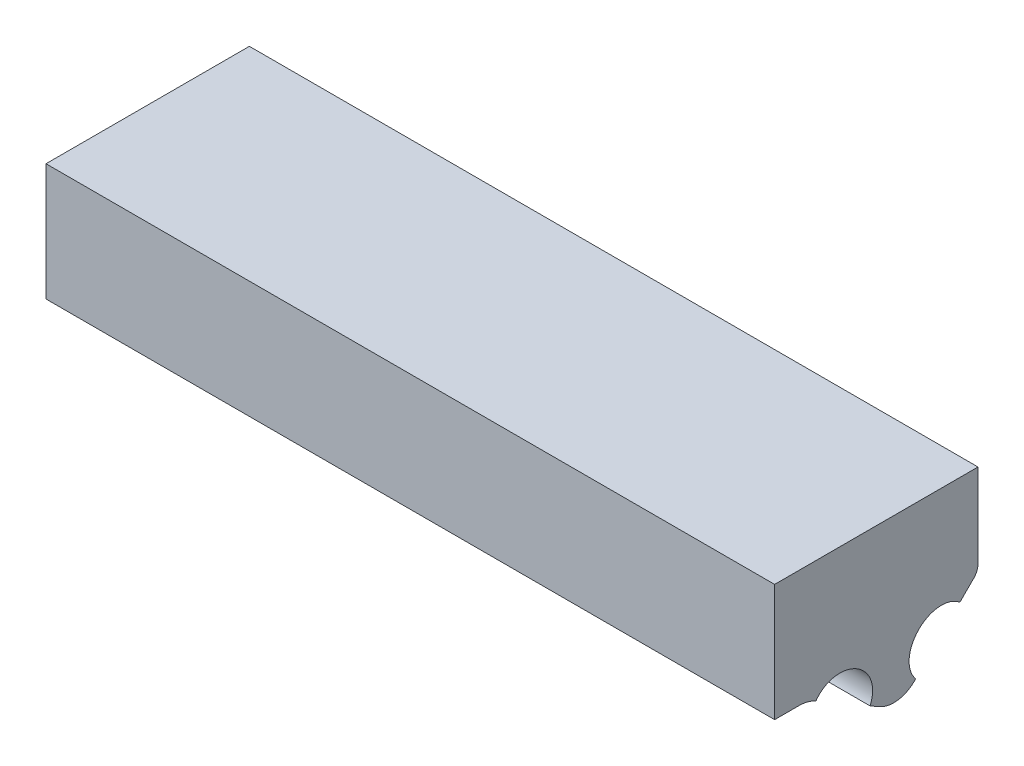
ISO-10303-21;
HEADER;
FILE_DESCRIPTION(('STEP AP214'),'2;1');
FILE_NAME('part.step','',(''),(''),'','','');
FILE_SCHEMA(('AUTOMOTIVE_DESIGN { 1 0 10303 214 1 1 1 1 }'));
ENDSEC;
DATA;
#1=APPLICATION_CONTEXT('core data for automotive mechanical design processes');
#2=APPLICATION_PROTOCOL_DEFINITION('international standard','automotive_design',2000,#1);
#3=PRODUCT_CONTEXT('',#1,'mechanical');
#4=PRODUCT('Part','Part','',(#3));
#5=PRODUCT_RELATED_PRODUCT_CATEGORY('part','',(#4));
#6=PRODUCT_DEFINITION_FORMATION('','',#4);
#7=PRODUCT_DEFINITION_CONTEXT('part definition',#1,'design');
#8=PRODUCT_DEFINITION('design','',#6,#7);
#9=PRODUCT_DEFINITION_SHAPE('','',#8);
#10=(LENGTH_UNIT() NAMED_UNIT(*) SI_UNIT(.MILLI.,.METRE.));
#11=(NAMED_UNIT(*) PLANE_ANGLE_UNIT() SI_UNIT($,.RADIAN.));
#12=(NAMED_UNIT(*) SI_UNIT($,.STERADIAN.) SOLID_ANGLE_UNIT());
#13=UNCERTAINTY_MEASURE_WITH_UNIT(LENGTH_MEASURE(1.E-05),#10,'distance_accuracy_value','');
#14=(GEOMETRIC_REPRESENTATION_CONTEXT(3) GLOBAL_UNCERTAINTY_ASSIGNED_CONTEXT((#13)) GLOBAL_UNIT_ASSIGNED_CONTEXT((#10,
#11,#12)) REPRESENTATION_CONTEXT('',''));
#15=CARTESIAN_POINT('',(0.,0.,0.));
#16=DIRECTION('',(0.,0.,1.));
#17=DIRECTION('',(1.,0.,0.));
#18=AXIS2_PLACEMENT_3D('',#15,#16,#17);
#19=CARTESIAN_POINT('',(50.,-9.04038059222874,13.2525126265847));
#20=DIRECTION('',(1.,0.,0.));
#21=DIRECTION('',(0.,-0.707106781186547,0.707106781186548));
#22=AXIS2_PLACEMENT_3D('',#19,#20,#21);
#23=ELLIPSE('',#22,2.15,2.);
#24=DIRECTION('',(-1.,0.,0.));
#25=VECTOR('',#24,1.);
#26=SURFACE_OF_LINEAR_EXTRUSION('',#23,#25);
#27=CARTESIAN_POINT('',(0.,-9.04038059222874,13.2525126265847));
#28=DIRECTION('',(1.,0.,0.));
#29=DIRECTION('',(0.,-0.707106781186547,0.707106781186548));
#30=AXIS2_PLACEMENT_3D('',#27,#28,#29);
#31=ELLIPSE('',#30,2.15,2.);
#32=CARTESIAN_POINT('',(0.,-7.41831681161244,11.8425808803244));
#33=VERTEX_POINT('',#32);
#34=CARTESIAN_POINT('',(0.,-10.4503123384891,14.874576407201));
#35=VERTEX_POINT('',#34);
#36=EDGE_CURVE('E161',#33,#35,#31,.T.);
#37=ORIENTED_EDGE('',*,*,#36,.F.);
#38=DIRECTION('',(-1.,0.,0.));
#39=VECTOR('',#38,1.);
#40=CARTESIAN_POINT('',(50.,-7.41831681161244,11.8425808803244));
#41=LINE('',#40,#39);
#42=CARTESIAN_POINT('',(50.,-7.41831681161244,11.8425808803244));
#43=VERTEX_POINT('',#42);
#44=EDGE_CURVE('E11',#43,#33,#41,.T.);
#45=ORIENTED_EDGE('',*,*,#44,.F.);
#46=CARTESIAN_POINT('',(50.,-10.4503123384891,14.874576407201));
#47=VERTEX_POINT('',#46);
#48=EDGE_CURVE('E192',#43,#47,#23,.T.);
#49=ORIENTED_EDGE('',*,*,#48,.T.);
#50=DIRECTION('',(-1.,0.,0.));
#51=VECTOR('',#50,1.);
#52=CARTESIAN_POINT('',(50.,-10.4503123384891,14.874576407201));
#53=LINE('',#52,#51);
#54=EDGE_CURVE('E58',#47,#35,#53,.T.);
#55=ORIENTED_EDGE('',*,*,#54,.T.);
#56=EDGE_LOOP('',(#37,#45,#49,#55));
#57=FACE_BOUND('',#56,.T.);
#58=ADVANCED_FACE('F41',(#57),#26,.T.);
#59=CARTESIAN_POINT('',(50.,2.21213203435598,2.21213203435599));
#60=DIRECTION('',(0.,-0.707106781186546,-0.707106781186549));
#61=DIRECTION('',(0.,0.707106781186549,-0.707106781186546));
#62=AXIS2_PLACEMENT_3D('',#59,#60,#61);
#63=PLANE('',#62);
#64=DIRECTION('',(0.,-0.707106781186549,0.707106781186546));
#65=VECTOR('',#64,1.);
#66=CARTESIAN_POINT('',(0.,2.21213203435598,2.21213203435599));
#67=LINE('',#66,#65);
#68=CARTESIAN_POINT('',(0.,-6.46862915010153,10.8928932188135));
#69=VERTEX_POINT('',#68);
#70=EDGE_CURVE('E163',#69,#33,#67,.T.);
#71=ORIENTED_EDGE('',*,*,#70,.F.);
#72=DIRECTION('',(-1.,0.,0.));
#73=VECTOR('',#72,1.);
#74=CARTESIAN_POINT('',(50.,-6.46862915010153,10.8928932188135));
#75=LINE('',#74,#73);
#76=CARTESIAN_POINT('',(50.,-6.46862915010153,10.8928932188135));
#77=VERTEX_POINT('',#76);
#78=EDGE_CURVE('E50',#77,#69,#75,.T.);
#79=ORIENTED_EDGE('',*,*,#78,.F.);
#80=DIRECTION('',(0.,-0.707106781186549,0.707106781186546));
#81=VECTOR('',#80,1.);
#82=CARTESIAN_POINT('',(50.,2.21213203435598,2.21213203435599));
#83=LINE('',#82,#81);
#84=EDGE_CURVE('E230',#77,#43,#83,.T.);
#85=ORIENTED_EDGE('',*,*,#84,.T.);
#86=ORIENTED_EDGE('',*,*,#44,.T.);
#87=EDGE_LOOP('',(#71,#79,#85,#86));
#88=FACE_BOUND('',#87,.T.);
#89=ADVANCED_FACE('F218',(#88),#63,.T.);
#90=CARTESIAN_POINT('',(50.,-5.76152236891497,11.6));
#91=DIRECTION('',(-1.,0.,0.));
#92=DIRECTION('',(0.,0.,1.));
#93=AXIS2_PLACEMENT_3D('',#90,#91,#92);
#94=CYLINDRICAL_SURFACE('',#93,1.);
#95=CARTESIAN_POINT('',(0.,-5.76152236891497,11.6));
#96=DIRECTION('',(1.,0.,0.));
#97=DIRECTION('',(0.,0.,-1.));
#98=AXIS2_PLACEMENT_3D('',#95,#96,#97);
#99=CIRCLE('',#98,1.);
#100=CARTESIAN_POINT('',(0.,-5.76152236891497,10.6));
#101=VERTEX_POINT('',#100);
#102=EDGE_CURVE('E166',#101,#69,#99,.F.);
#103=ORIENTED_EDGE('',*,*,#102,.F.);
#104=DIRECTION('',(-1.,0.,0.));
#105=VECTOR('',#104,1.);
#106=CARTESIAN_POINT('',(50.,-5.76152236891497,10.6));
#107=LINE('',#106,#105);
#108=CARTESIAN_POINT('',(50.,-5.76152236891497,10.6));
#109=VERTEX_POINT('',#108);
#110=EDGE_CURVE('E207',#109,#101,#107,.T.);
#111=ORIENTED_EDGE('',*,*,#110,.F.);
#112=CARTESIAN_POINT('',(50.,-5.76152236891497,11.6));
#113=DIRECTION('',(1.,0.,0.));
#114=DIRECTION('',(0.,0.,-1.));
#115=AXIS2_PLACEMENT_3D('',#112,#113,#114);
#116=CIRCLE('',#115,1.);
#117=EDGE_CURVE('E214',#109,#77,#116,.F.);
#118=ORIENTED_EDGE('',*,*,#117,.T.);
#119=ORIENTED_EDGE('',*,*,#78,.T.);
#120=EDGE_LOOP('',(#103,#111,#118,#119));
#121=FACE_BOUND('',#120,.T.);
#122=ADVANCED_FACE('F212',(#121),#94,.T.);
#123=CARTESIAN_POINT('',(50.,0.,10.6));
#124=DIRECTION('',(0.,0.,-1.));
#125=DIRECTION('',(-1.,0.,0.));
#126=AXIS2_PLACEMENT_3D('',#123,#124,#125);
#127=PLANE('',#126);
#128=DIRECTION('',(0.,-1.,0.));
#129=VECTOR('',#128,1.);
#130=CARTESIAN_POINT('',(0.,0.,10.6));
#131=LINE('',#130,#129);
#132=CARTESIAN_POINT('',(0.,0.,10.6));
#133=VERTEX_POINT('',#132);
#134=EDGE_CURVE('E169',#133,#101,#131,.T.);
#135=ORIENTED_EDGE('',*,*,#134,.F.);
#136=DIRECTION('',(-1.,0.,0.));
#137=VECTOR('',#136,1.);
#138=CARTESIAN_POINT('',(50.,0.,10.6));
#139=LINE('',#138,#137);
#140=CARTESIAN_POINT('',(50.,0.,10.6));
#141=VERTEX_POINT('',#140);
#142=EDGE_CURVE('E205',#141,#133,#139,.T.);
#143=ORIENTED_EDGE('',*,*,#142,.F.);
#144=DIRECTION('',(0.,-1.,0.));
#145=VECTOR('',#144,1.);
#146=CARTESIAN_POINT('',(50.,0.,10.6));
#147=LINE('',#146,#145);
#148=EDGE_CURVE('E227',#141,#109,#147,.T.);
#149=ORIENTED_EDGE('',*,*,#148,.T.);
#150=ORIENTED_EDGE('',*,*,#110,.T.);
#151=EDGE_LOOP('',(#135,#143,#149,#150));
#152=FACE_BOUND('',#151,.T.);
#153=ADVANCED_FACE('F224',(#152),#127,.T.);
#154=CARTESIAN_POINT('',(50.,0.,0.));
#155=DIRECTION('',(0.,1.,0.));
#156=DIRECTION('',(0.,0.,1.));
#157=AXIS2_PLACEMENT_3D('',#154,#155,#156);
#158=PLANE('',#157);
#159=DIRECTION('',(0.,0.,-1.));
#160=VECTOR('',#159,1.);
#161=CARTESIAN_POINT('',(0.,0.,0.));
#162=LINE('',#161,#160);
#163=CARTESIAN_POINT('',(0.,0.,24.5558641755391));
#164=VERTEX_POINT('',#163);
#165=EDGE_CURVE('E172',#164,#133,#162,.T.);
#166=ORIENTED_EDGE('',*,*,#165,.F.);
#167=DIRECTION('',(-1.,0.,0.));
#168=VECTOR('',#167,1.);
#169=CARTESIAN_POINT('',(50.,0.,24.5558641755391));
#170=LINE('',#169,#168);
#171=CARTESIAN_POINT('',(50.,0.,24.5558641755391));
#172=VERTEX_POINT('',#171);
#173=EDGE_CURVE('E203',#172,#164,#170,.T.);
#174=ORIENTED_EDGE('',*,*,#173,.F.);
#175=DIRECTION('',(0.,0.,-1.));
#176=VECTOR('',#175,1.);
#177=CARTESIAN_POINT('',(50.,0.,0.));
#178=LINE('',#177,#176);
#179=EDGE_CURVE('E232',#172,#141,#178,.T.);
#180=ORIENTED_EDGE('',*,*,#179,.T.);
#181=ORIENTED_EDGE('',*,*,#142,.T.);
#182=EDGE_LOOP('',(#166,#174,#180,#181));
#183=FACE_BOUND('',#182,.T.);
#184=ADVANCED_FACE('F318',(#183),#158,.T.);
#185=CARTESIAN_POINT('',(50.,0.,24.5558641755391));
#186=DIRECTION('',(0.,0.,1.));
#187=DIRECTION('',(1.,0.,0.));
#188=AXIS2_PLACEMENT_3D('',#185,#186,#187);
#189=PLANE('',#188);
#190=DIRECTION('',(0.,1.,0.));
#191=VECTOR('',#190,1.);
#192=CARTESIAN_POINT('',(0.,0.,24.5558641755391));
#193=LINE('',#192,#191);
#194=CARTESIAN_POINT('',(0.,-8.04065123034669,24.5558641755391));
#195=VERTEX_POINT('',#194);
#196=EDGE_CURVE('E175',#195,#164,#193,.T.);
#197=ORIENTED_EDGE('',*,*,#196,.F.);
#198=DIRECTION('',(-1.,0.,0.));
#199=VECTOR('',#198,1.);
#200=CARTESIAN_POINT('',(50.,-8.04065123034669,24.5558641755391));
#201=LINE('',#200,#199);
#202=CARTESIAN_POINT('',(50.,-8.04065123034669,24.5558641755391));
#203=VERTEX_POINT('',#202);
#204=EDGE_CURVE('E201',#203,#195,#201,.T.);
#205=ORIENTED_EDGE('',*,*,#204,.F.);
#206=DIRECTION('',(0.,1.,0.));
#207=VECTOR('',#206,1.);
#208=CARTESIAN_POINT('',(50.,0.,24.5558641755391));
#209=LINE('',#208,#207);
#210=EDGE_CURVE('E237',#203,#172,#209,.T.);
#211=ORIENTED_EDGE('',*,*,#210,.T.);
#212=ORIENTED_EDGE('',*,*,#173,.T.);
#213=EDGE_LOOP('',(#197,#205,#211,#212));
#214=FACE_BOUND('',#213,.T.);
#215=ADVANCED_FACE('F308',(#214),#189,.T.);
#216=CARTESIAN_POINT('',(50.,-8.04065123034671,0.));
#217=DIRECTION('',(0.,-1.,0.));
#218=DIRECTION('',(0.,0.,-1.));
#219=AXIS2_PLACEMENT_3D('',#216,#217,#218);
#220=PLANE('',#219);
#221=DIRECTION('',(0.,0.,1.));
#222=VECTOR('',#221,1.);
#223=CARTESIAN_POINT('',(0.,-8.04065123034671,0.));
#224=LINE('',#223,#222);
#225=CARTESIAN_POINT('',(0.,-8.04065123034669,22.8740763765164));
#226=VERTEX_POINT('',#225);
#227=EDGE_CURVE('E178',#226,#195,#224,.T.);
#228=ORIENTED_EDGE('',*,*,#227,.F.);
#229=DIRECTION('',(-1.,0.,0.));
#230=VECTOR('',#229,1.);
#231=CARTESIAN_POINT('',(50.,-8.04065123034669,22.8740763765164));
#232=LINE('',#231,#230);
#233=CARTESIAN_POINT('',(50.,-8.04065123034669,22.8740763765164));
#234=VERTEX_POINT('',#233);
#235=EDGE_CURVE('E199',#234,#226,#232,.T.);
#236=ORIENTED_EDGE('',*,*,#235,.F.);
#237=DIRECTION('',(0.,0.,1.));
#238=VECTOR('',#237,1.);
#239=CARTESIAN_POINT('',(50.,-8.04065123034671,0.));
#240=LINE('',#239,#238);
#241=EDGE_CURVE('E240',#234,#203,#240,.T.);
#242=ORIENTED_EDGE('',*,*,#241,.T.);
#243=ORIENTED_EDGE('',*,*,#204,.T.);
#244=EDGE_LOOP('',(#228,#236,#242,#243));
#245=FACE_BOUND('',#244,.T.);
#246=ADVANCED_FACE('F251',(#245),#220,.T.);
#247=CARTESIAN_POINT('',(50.,-10.3406512303466,22.8740763765164));
#248=DIRECTION('',(-1.,0.,0.));
#249=DIRECTION('',(0.,0.,1.));
#250=AXIS2_PLACEMENT_3D('',#247,#248,#249);
#251=CYLINDRICAL_SURFACE('',#250,2.29999999999992);
#252=CARTESIAN_POINT('',(0.,-10.3406512303466,22.8740763765164));
#253=DIRECTION('',(1.,0.,0.));
#254=DIRECTION('',(0.,0.,-1.));
#255=AXIS2_PLACEMENT_3D('',#252,#253,#254);
#256=CIRCLE('',#255,2.29999999999992);
#257=CARTESIAN_POINT('',(0.,-8.34879280164247,21.7240763765164));
#258=VERTEX_POINT('',#257);
#259=EDGE_CURVE('E181',#258,#226,#256,.T.);
#260=ORIENTED_EDGE('',*,*,#259,.F.);
#261=DIRECTION('',(-1.,0.,0.));
#262=VECTOR('',#261,1.);
#263=CARTESIAN_POINT('',(50.,-8.34879280164247,21.7240763765164));
#264=LINE('',#263,#262);
#265=CARTESIAN_POINT('',(50.,-8.34879280164247,21.7240763765164));
#266=VERTEX_POINT('',#265);
#267=EDGE_CURVE('E196',#266,#258,#264,.T.);
#268=ORIENTED_EDGE('',*,*,#267,.F.);
#269=CARTESIAN_POINT('',(50.,-10.3406512303466,22.8740763765164));
#270=DIRECTION('',(1.,0.,0.));
#271=DIRECTION('',(0.,0.,-1.));
#272=AXIS2_PLACEMENT_3D('',#269,#270,#271);
#273=CIRCLE('',#272,2.29999999999992);
#274=EDGE_CURVE('E155',#266,#234,#273,.T.);
#275=ORIENTED_EDGE('',*,*,#274,.T.);
#276=ORIENTED_EDGE('',*,*,#235,.T.);
#277=EDGE_LOOP('',(#260,#268,#275,#276));
#278=FACE_BOUND('',#277,.T.);
#279=ADVANCED_FACE('F246',(#278),#251,.F.);
#280=CARTESIAN_POINT('',(50.,-9.55066891100103,19.9423658907042));
#281=DIRECTION('',(1.,0.,0.));
#282=DIRECTION('',(0.,-0.500000000000003,-0.866025403784437));
#283=AXIS2_PLACEMENT_3D('',#280,#281,#282);
#284=ELLIPSE('',#283,2.15,2.);
#285=DIRECTION('',(-1.,0.,0.));
#286=VECTOR('',#285,1.);
#287=SURFACE_OF_LINEAR_EXTRUSION('',#284,#286);
#288=ORIENTED_EDGE('',*,*,#267,.T.);
#289=CARTESIAN_POINT('',(0.,-9.55066891100103,19.9423658907042));
#290=DIRECTION('',(1.,0.,0.));
#291=DIRECTION('',(0.,-0.500000000000003,-0.866025403784437));
#292=AXIS2_PLACEMENT_3D('',#289,#290,#291);
#293=ELLIPSE('',#292,2.15,2.);
#294=CARTESIAN_POINT('',(0.,-10.4927373992242,18.010655404892));
#295=VERTEX_POINT('',#294);
#296=EDGE_CURVE('E184',#295,#258,#293,.T.);
#297=ORIENTED_EDGE('',*,*,#296,.F.);
#298=DIRECTION('',(-1.,0.,0.));
#299=VECTOR('',#298,1.);
#300=CARTESIAN_POINT('',(50.,-10.4927373992242,18.010655404892));
#301=LINE('',#300,#299);
#302=CARTESIAN_POINT('',(50.,-10.4927373992242,18.010655404892));
#303=VERTEX_POINT('',#302);
#304=EDGE_CURVE('E142',#303,#295,#301,.T.);
#305=ORIENTED_EDGE('',*,*,#304,.F.);
#306=EDGE_CURVE('E153',#303,#266,#284,.T.);
#307=ORIENTED_EDGE('',*,*,#306,.T.);
#308=EDGE_LOOP('',(#288,#297,#305,#307));
#309=FACE_BOUND('',#308,.T.);
#310=ADVANCED_FACE('F255',(#309),#287,.T.);
#311=CARTESIAN_POINT('',(50.,-15.6683956091401,9.04615242270848));
#312=DIRECTION('',(0.,-0.866025403784393,0.500000000000078));
#313=DIRECTION('',(0.,-0.500000000000078,-0.866025403784393));
#314=AXIS2_PLACEMENT_3D('',#311,#312,#313);
#315=PLANE('',#314);
#316=DIRECTION('',(0.,0.500000000000078,0.866025403784393));
#317=VECTOR('',#316,1.);
#318=CARTESIAN_POINT('',(0.,-15.6683956091401,9.04615242270848));
#319=LINE('',#318,#317);
#320=CARTESIAN_POINT('',(0.,-10.8577663426889,17.3784067285781));
#321=VERTEX_POINT('',#320);
#322=EDGE_CURVE('E139',#321,#295,#319,.T.);
#323=ORIENTED_EDGE('',*,*,#322,.F.);
#324=DIRECTION('',(-1.,0.,0.));
#325=VECTOR('',#324,1.);
#326=CARTESIAN_POINT('',(50.,-10.8577663426889,17.3784067285781));
#327=LINE('',#326,#325);
#328=CARTESIAN_POINT('',(50.,-10.8577663426889,17.3784067285781));
#329=VERTEX_POINT('',#328);
#330=EDGE_CURVE('E133',#329,#321,#327,.T.);
#331=ORIENTED_EDGE('',*,*,#330,.F.);
#332=DIRECTION('',(0.,0.500000000000078,0.866025403784393));
#333=VECTOR('',#332,1.);
#334=CARTESIAN_POINT('',(50.,-15.6683956091401,9.04615242270848));
#335=LINE('',#334,#333);
#336=EDGE_CURVE('E137',#329,#303,#335,.T.);
#337=ORIENTED_EDGE('',*,*,#336,.T.);
#338=ORIENTED_EDGE('',*,*,#304,.T.);
#339=EDGE_LOOP('',(#323,#331,#337,#338));
#340=FACE_BOUND('',#339,.T.);
#341=ADVANCED_FACE('F135',(#340),#315,.T.);
#342=CARTESIAN_POINT('',(50.,-9.12571553511999,16.3784067285781));
#343=DIRECTION('',(-1.,0.,0.));
#344=DIRECTION('',(0.,0.,1.));
#345=AXIS2_PLACEMENT_3D('',#342,#343,#344);
#346=CYLINDRICAL_SURFACE('',#345,1.99999999999999);
#347=CARTESIAN_POINT('',(0.,-9.12571553511999,16.3784067285781));
#348=DIRECTION('',(1.,0.,0.));
#349=DIRECTION('',(0.,0.,-1.));
#350=AXIS2_PLACEMENT_3D('',#347,#348,#349);
#351=CIRCLE('',#350,1.99999999999999);
#352=CARTESIAN_POINT('',(0.,-10.5399290974931,14.964193166205));
#353=VERTEX_POINT('',#352);
#354=EDGE_CURVE('E187',#321,#353,#351,.T.);
#355=ORIENTED_EDGE('',*,*,#354,.T.);
#356=DIRECTION('',(-1.,0.,0.));
#357=VECTOR('',#356,1.);
#358=CARTESIAN_POINT('',(50.,-10.5399290974931,14.964193166205));
#359=LINE('',#358,#357);
#360=CARTESIAN_POINT('',(50.,-10.5399290974931,14.964193166205));
#361=VERTEX_POINT('',#360);
#362=EDGE_CURVE('E96',#361,#353,#359,.T.);
#363=ORIENTED_EDGE('',*,*,#362,.F.);
#364=CARTESIAN_POINT('',(50.,-9.12571553511999,16.3784067285781));
#365=DIRECTION('',(1.,0.,0.));
#366=DIRECTION('',(0.,0.,-1.));
#367=AXIS2_PLACEMENT_3D('',#364,#365,#366);
#368=CIRCLE('',#367,1.99999999999999);
#369=EDGE_CURVE('E144',#329,#361,#368,.T.);
#370=ORIENTED_EDGE('',*,*,#369,.F.);
#371=ORIENTED_EDGE('',*,*,#330,.T.);
#372=EDGE_LOOP('',(#355,#363,#370,#371));
#373=FACE_BOUND('',#372,.T.);
#374=ADVANCED_FACE('F145',(#373),#346,.T.);
#375=CARTESIAN_POINT('',(50.,2.21213203435555,2.21213203435538));
#376=DIRECTION('',(0.,-0.707106781186575,-0.70710678118652));
#377=DIRECTION('',(0.,0.70710678118652,-0.707106781186575));
#378=AXIS2_PLACEMENT_3D('',#375,#376,#377);
#379=PLANE('',#378);
#380=DIRECTION('',(0.,-0.70710678118652,0.707106781186575));
#381=VECTOR('',#380,1.);
#382=CARTESIAN_POINT('',(0.,2.21213203435555,2.21213203435538));
#383=LINE('',#382,#381);
#384=EDGE_CURVE('E189',#35,#353,#383,.T.);
#385=ORIENTED_EDGE('',*,*,#384,.F.);
#386=ORIENTED_EDGE('',*,*,#54,.F.);
#387=DIRECTION('',(0.,-0.70710678118652,0.707106781186575));
#388=VECTOR('',#387,1.);
#389=CARTESIAN_POINT('',(50.,2.21213203435555,2.21213203435538));
#390=LINE('',#389,#388);
#391=EDGE_CURVE('E148',#47,#361,#390,.T.);
#392=ORIENTED_EDGE('',*,*,#391,.T.);
#393=ORIENTED_EDGE('',*,*,#362,.T.);
#394=EDGE_LOOP('',(#385,#386,#392,#393));
#395=FACE_BOUND('',#394,.T.);
#396=ADVANCED_FACE('F271',(#395),#379,.T.);
#397=CARTESIAN_POINT('',(50.,0.,0.));
#398=DIRECTION('',(1.,0.,0.));
#399=DIRECTION('',(0.,0.,-1.));
#400=AXIS2_PLACEMENT_3D('',#397,#398,#399);
#401=PLANE('',#400);
#402=ORIENTED_EDGE('',*,*,#48,.F.);
#403=ORIENTED_EDGE('',*,*,#84,.F.);
#404=ORIENTED_EDGE('',*,*,#117,.F.);
#405=ORIENTED_EDGE('',*,*,#148,.F.);
#406=ORIENTED_EDGE('',*,*,#179,.F.);
#407=ORIENTED_EDGE('',*,*,#210,.F.);
#408=ORIENTED_EDGE('',*,*,#241,.F.);
#409=ORIENTED_EDGE('',*,*,#274,.F.);
#410=ORIENTED_EDGE('',*,*,#306,.F.);
#411=ORIENTED_EDGE('',*,*,#336,.F.);
#412=ORIENTED_EDGE('',*,*,#369,.T.);
#413=ORIENTED_EDGE('',*,*,#391,.F.);
#414=EDGE_LOOP('',(#402,#403,#404,#405,#406,#407,#408,#409,#410,#411,#412,#413));
#415=FACE_BOUND('',#414,.T.);
#416=ADVANCED_FACE('F151',(#415),#401,.T.);
#417=CARTESIAN_POINT('',(0.,0.,0.));
#418=DIRECTION('',(1.,0.,0.));
#419=DIRECTION('',(0.,0.,-1.));
#420=AXIS2_PLACEMENT_3D('',#417,#418,#419);
#421=PLANE('',#420);
#422=ORIENTED_EDGE('',*,*,#36,.T.);
#423=ORIENTED_EDGE('',*,*,#384,.T.);
#424=ORIENTED_EDGE('',*,*,#354,.F.);
#425=ORIENTED_EDGE('',*,*,#322,.T.);
#426=ORIENTED_EDGE('',*,*,#296,.T.);
#427=ORIENTED_EDGE('',*,*,#259,.T.);
#428=ORIENTED_EDGE('',*,*,#227,.T.);
#429=ORIENTED_EDGE('',*,*,#196,.T.);
#430=ORIENTED_EDGE('',*,*,#165,.T.);
#431=ORIENTED_EDGE('',*,*,#134,.T.);
#432=ORIENTED_EDGE('',*,*,#102,.T.);
#433=ORIENTED_EDGE('',*,*,#70,.T.);
#434=EDGE_LOOP('',(#422,#423,#424,#425,#426,#427,#428,#429,#430,#431,#432,#433));
#435=FACE_BOUND('',#434,.T.);
#436=ADVANCED_FACE('F220',(#435),#421,.F.);
#437=CLOSED_SHELL('',(#58,#89,#122,#153,#184,#215,#246,#279,#310,#341,#374,#396,#416,#436));
#438=MANIFOLD_SOLID_BREP('B2',#437);
#439=ADVANCED_BREP_SHAPE_REPRESENTATION('',(#18,#438),#14);
#440=SHAPE_DEFINITION_REPRESENTATION(#9,#439);
ENDSEC;
END-ISO-10303-21;
